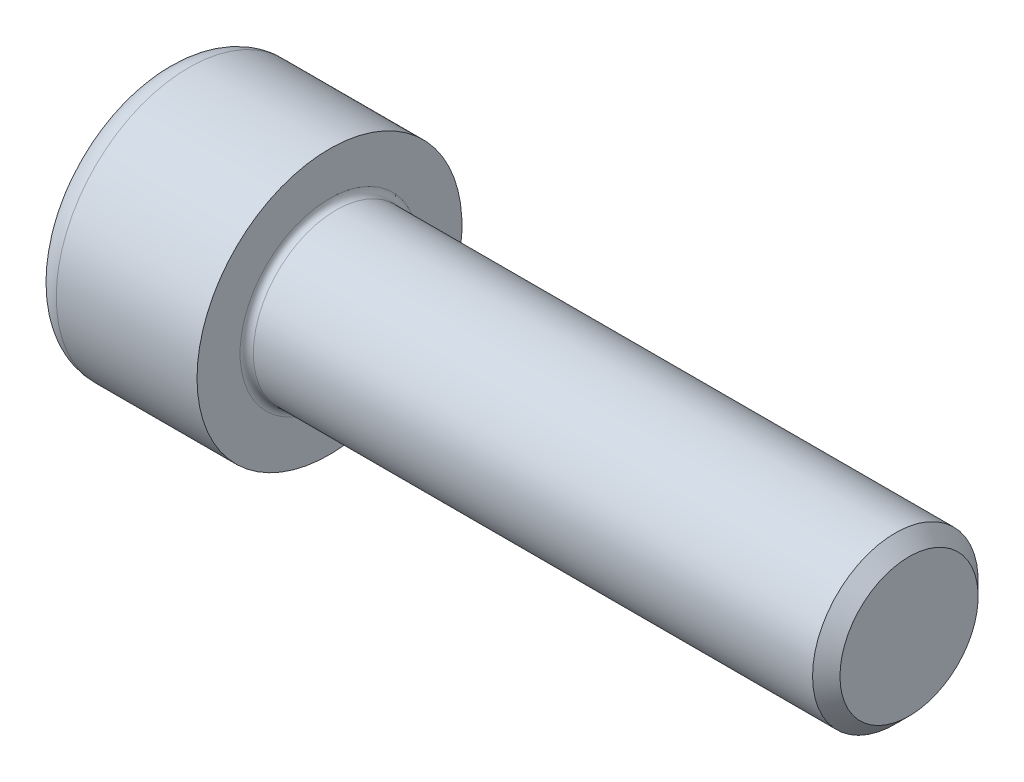
ISO-10303-21;
HEADER;
FILE_DESCRIPTION(('STEP AP214'),'2;1');
FILE_NAME('part.step','',(''),(''),'','','');
FILE_SCHEMA(('AUTOMOTIVE_DESIGN { 1 0 10303 214 1 1 1 1 }'));
ENDSEC;
DATA;
#1=APPLICATION_CONTEXT('core data for automotive mechanical design processes');
#2=APPLICATION_PROTOCOL_DEFINITION('international standard','automotive_design',2000,#1);
#3=PRODUCT_CONTEXT('',#1,'mechanical');
#4=PRODUCT('Part','Part','',(#3));
#5=PRODUCT_RELATED_PRODUCT_CATEGORY('part','',(#4));
#6=PRODUCT_DEFINITION_FORMATION('','',#4);
#7=PRODUCT_DEFINITION_CONTEXT('part definition',#1,'design');
#8=PRODUCT_DEFINITION('design','',#6,#7);
#9=PRODUCT_DEFINITION_SHAPE('','',#8);
#10=(LENGTH_UNIT() NAMED_UNIT(*) SI_UNIT(.MILLI.,.METRE.));
#11=(NAMED_UNIT(*) PLANE_ANGLE_UNIT() SI_UNIT($,.RADIAN.));
#12=(NAMED_UNIT(*) SI_UNIT($,.STERADIAN.) SOLID_ANGLE_UNIT());
#13=UNCERTAINTY_MEASURE_WITH_UNIT(LENGTH_MEASURE(1.E-05),#10,'distance_accuracy_value','');
#14=(GEOMETRIC_REPRESENTATION_CONTEXT(3) GLOBAL_UNCERTAINTY_ASSIGNED_CONTEXT((#13)) GLOBAL_UNIT_ASSIGNED_CONTEXT((#10,
#11,#12)) REPRESENTATION_CONTEXT('',''));
#15=CARTESIAN_POINT('',(0.,0.,0.));
#16=DIRECTION('',(0.,0.,1.));
#17=DIRECTION('',(1.,0.,0.));
#18=AXIS2_PLACEMENT_3D('',#15,#16,#17);
#19=CARTESIAN_POINT('',(0.,0.,0.));
#20=DIRECTION('',(-1.,0.,0.));
#21=DIRECTION('',(0.,0.,1.));
#22=AXIS2_PLACEMENT_3D('',#19,#20,#21);
#23=PLANE('',#22);
#24=DIRECTION('',(0.,-0.499999999999998,0.86602540378444));
#25=VECTOR('',#24,1.);
#26=CARTESIAN_POINT('',(0.,4.68519743447381,0.));
#27=LINE('',#26,#25);
#28=CARTESIAN_POINT('',(0.,4.68519743447381,0.));
#29=VERTEX_POINT('',#28);
#30=CARTESIAN_POINT('',(0.,2.34259871723691,4.05749999999999));
#31=VERTEX_POINT('',#30);
#32=EDGE_CURVE('E258',#29,#31,#27,.T.);
#33=ORIENTED_EDGE('',*,*,#32,.T.);
#34=DIRECTION('',(0.,1.,0.));
#35=VECTOR('',#34,1.);
#36=CARTESIAN_POINT('',(0.,-2.3425987172369,4.05749999999999));
#37=LINE('',#36,#35);
#38=CARTESIAN_POINT('',(0.,-2.3425987172369,4.05749999999999));
#39=VERTEX_POINT('',#38);
#40=EDGE_CURVE('E130',#39,#31,#37,.T.);
#41=ORIENTED_EDGE('',*,*,#40,.F.);
#42=DIRECTION('',(0.,-0.500000000000001,-0.866025403784438));
#43=VECTOR('',#42,1.);
#44=CARTESIAN_POINT('',(0.,-2.3425987172369,4.05749999999999));
#45=LINE('',#44,#43);
#46=CARTESIAN_POINT('',(0.,-4.68519743447381,0.));
#47=VERTEX_POINT('',#46);
#48=EDGE_CURVE('E261',#39,#47,#45,.T.);
#49=ORIENTED_EDGE('',*,*,#48,.T.);
#50=DIRECTION('',(0.,0.499999999999998,-0.86602540378444));
#51=VECTOR('',#50,1.);
#52=CARTESIAN_POINT('',(0.,-4.68519743447381,0.));
#53=LINE('',#52,#51);
#54=CARTESIAN_POINT('',(0.,-2.34259871723691,-4.0575));
#55=VERTEX_POINT('',#54);
#56=EDGE_CURVE('E264',#47,#55,#53,.T.);
#57=ORIENTED_EDGE('',*,*,#56,.T.);
#58=DIRECTION('',(0.,-1.,0.));
#59=VECTOR('',#58,1.);
#60=CARTESIAN_POINT('',(0.,2.3425987172369,-4.05750000000001));
#61=LINE('',#60,#59);
#62=CARTESIAN_POINT('',(0.,2.3425987172369,-4.05750000000001));
#63=VERTEX_POINT('',#62);
#64=EDGE_CURVE('E267',#63,#55,#61,.T.);
#65=ORIENTED_EDGE('',*,*,#64,.F.);
#66=DIRECTION('',(0.,-0.500000000000001,-0.866025403784438));
#67=VECTOR('',#66,1.);
#68=CARTESIAN_POINT('',(0.,4.68519743447381,0.));
#69=LINE('',#68,#67);
#70=EDGE_CURVE('E125',#29,#63,#69,.T.);
#71=ORIENTED_EDGE('',*,*,#70,.F.);
#72=EDGE_LOOP('',(#33,#41,#49,#57,#65,#71));
#73=FACE_BOUND('',#72,.T.);
#74=CARTESIAN_POINT('',(0.,0.,0.));
#75=DIRECTION('',(-1.,0.,0.));
#76=DIRECTION('',(0.,0.,1.));
#77=AXIS2_PLACEMENT_3D('',#74,#75,#76);
#78=CIRCLE('',#77,6.5);
#79=CARTESIAN_POINT('',(0.,0.,6.5));
#80=VERTEX_POINT('',#79);
#81=EDGE_CURVE('E42',#80,#80,#78,.T.);
#82=ORIENTED_EDGE('',*,*,#81,.T.);
#83=EDGE_LOOP('',(#82));
#84=FACE_BOUND('',#83,.T.);
#85=ADVANCED_FACE('F34',(#73,#84),#23,.T.);
#86=CARTESIAN_POINT('',(-31.75,0.,0.));
#87=DIRECTION('',(-1.,0.,0.));
#88=DIRECTION('',(0.,0.,1.));
#89=AXIS2_PLACEMENT_3D('',#86,#87,#88);
#90=CYLINDRICAL_SURFACE('',#89,8.);
#91=CARTESIAN_POINT('',(1.5,0.,0.));
#92=DIRECTION('',(-1.,0.,0.));
#93=DIRECTION('',(0.,0.,1.));
#94=AXIS2_PLACEMENT_3D('',#91,#92,#93);
#95=CIRCLE('',#94,8.);
#96=CARTESIAN_POINT('',(1.5,0.,8.));
#97=VERTEX_POINT('',#96);
#98=EDGE_CURVE('E11',#97,#97,#95,.F.);
#99=ORIENTED_EDGE('',*,*,#98,.T.);
#100=EDGE_LOOP('',(#99));
#101=FACE_BOUND('',#100,.T.);
#102=CARTESIAN_POINT('',(10.,0.,0.));
#103=DIRECTION('',(-1.,0.,0.));
#104=DIRECTION('',(0.,0.,1.));
#105=AXIS2_PLACEMENT_3D('',#102,#103,#104);
#106=CIRCLE('',#105,8.);
#107=CARTESIAN_POINT('',(10.,0.,8.));
#108=VERTEX_POINT('',#107);
#109=EDGE_CURVE('E148',#108,#108,#106,.T.);
#110=ORIENTED_EDGE('',*,*,#109,.T.);
#111=EDGE_LOOP('',(#110));
#112=FACE_BOUND('',#111,.T.);
#113=ADVANCED_FACE('F172',(#101,#112),#90,.T.);
#114=CARTESIAN_POINT('',(10.,8.,0.));
#115=DIRECTION('',(1.,0.,0.));
#116=DIRECTION('',(0.,0.,-1.));
#117=AXIS2_PLACEMENT_3D('',#114,#115,#116);
#118=PLANE('',#117);
#119=CARTESIAN_POINT('',(10.,0.,0.));
#120=DIRECTION('',(1.,0.,0.));
#121=DIRECTION('',(0.,0.,-1.));
#122=AXIS2_PLACEMENT_3D('',#119,#120,#121);
#123=CIRCLE('',#122,5.39999999999993);
#124=CARTESIAN_POINT('',(10.,0.,-5.39999999999993));
#125=VERTEX_POINT('',#124);
#126=EDGE_CURVE('E151',#125,#125,#123,.F.);
#127=ORIENTED_EDGE('',*,*,#126,.T.);
#128=EDGE_LOOP('',(#127));
#129=FACE_BOUND('',#128,.T.);
#130=ORIENTED_EDGE('',*,*,#109,.F.);
#131=EDGE_LOOP('',(#130));
#132=FACE_BOUND('',#131,.T.);
#133=ADVANCED_FACE('F178',(#129,#132),#118,.T.);
#134=CARTESIAN_POINT('',(-31.75,0.,0.));
#135=DIRECTION('',(-1.,0.,0.));
#136=DIRECTION('',(0.,0.,1.));
#137=AXIS2_PLACEMENT_3D('',#134,#135,#136);
#138=CYLINDRICAL_SURFACE('',#137,4.99999999999993);
#139=CARTESIAN_POINT('',(10.4,0.,0.));
#140=DIRECTION('',(1.,0.,0.));
#141=DIRECTION('',(0.,0.,-1.));
#142=AXIS2_PLACEMENT_3D('',#139,#140,#141);
#143=CIRCLE('',#142,4.99999999999993);
#144=CARTESIAN_POINT('',(10.4,0.,-4.99999999999993));
#145=VERTEX_POINT('',#144);
#146=EDGE_CURVE('E154',#145,#145,#143,.T.);
#147=ORIENTED_EDGE('',*,*,#146,.T.);
#148=EDGE_LOOP('',(#147));
#149=FACE_BOUND('',#148,.T.);
#150=CARTESIAN_POINT('',(44.1719999999999,0.,0.));
#151=DIRECTION('',(-1.,0.,0.));
#152=DIRECTION('',(0.,0.,1.));
#153=AXIS2_PLACEMENT_3D('',#150,#151,#152);
#154=CIRCLE('',#153,4.99999999999986);
#155=CARTESIAN_POINT('',(44.1719999999999,0.,4.99999999999986));
#156=VERTEX_POINT('',#155);
#157=EDGE_CURVE('E145',#156,#156,#154,.T.);
#158=ORIENTED_EDGE('',*,*,#157,.T.);
#159=EDGE_LOOP('',(#158));
#160=FACE_BOUND('',#159,.T.);
#161=ADVANCED_FACE('F184',(#149,#160),#138,.T.);
#162=CARTESIAN_POINT('',(45.,0.,0.));
#163=DIRECTION('',(-1.,0.,0.));
#164=DIRECTION('',(0.,0.,1.));
#165=AXIS2_PLACEMENT_3D('',#162,#163,#164);
#166=CONICAL_SURFACE('',#165,4.172,0.785398163397283);
#167=ORIENTED_EDGE('',*,*,#157,.F.);
#168=EDGE_LOOP('',(#167));
#169=FACE_BOUND('',#168,.T.);
#170=CARTESIAN_POINT('',(45.,0.,0.));
#171=DIRECTION('',(-1.,0.,0.));
#172=DIRECTION('',(0.,0.,1.));
#173=AXIS2_PLACEMENT_3D('',#170,#171,#172);
#174=CIRCLE('',#173,4.172);
#175=CARTESIAN_POINT('',(45.,0.,4.172));
#176=VERTEX_POINT('',#175);
#177=EDGE_CURVE('E141',#176,#176,#174,.T.);
#178=ORIENTED_EDGE('',*,*,#177,.T.);
#179=EDGE_LOOP('',(#178));
#180=FACE_BOUND('',#179,.T.);
#181=ADVANCED_FACE('F188',(#169,#180),#166,.T.);
#182=CARTESIAN_POINT('',(45.,4.172,0.));
#183=DIRECTION('',(1.,0.,0.));
#184=DIRECTION('',(0.,0.,-1.));
#185=AXIS2_PLACEMENT_3D('',#182,#183,#184);
#186=PLANE('',#185);
#187=ORIENTED_EDGE('',*,*,#177,.F.);
#188=EDGE_LOOP('',(#187));
#189=FACE_BOUND('',#188,.T.);
#190=ADVANCED_FACE('F168',(#189),#186,.T.);
#191=CARTESIAN_POINT('',(10.4,0.,0.));
#192=DIRECTION('',(1.,0.,0.));
#193=DIRECTION('',(0.,0.,-1.));
#194=AXIS2_PLACEMENT_3D('',#191,#192,#193);
#195=TOROIDAL_SURFACE('',#194,5.39999999999993,0.4);
#196=ORIENTED_EDGE('',*,*,#146,.F.);
#197=EDGE_LOOP('',(#196));
#198=FACE_BOUND('',#197,.T.);
#199=ORIENTED_EDGE('',*,*,#126,.F.);
#200=EDGE_LOOP('',(#199));
#201=FACE_BOUND('',#200,.T.);
#202=ADVANCED_FACE('F161',(#198,#201),#195,.F.);
#203=CARTESIAN_POINT('',(1.5,0.,0.));
#204=DIRECTION('',(-1.,0.,0.));
#205=DIRECTION('',(0.,0.,1.));
#206=AXIS2_PLACEMENT_3D('',#203,#204,#205);
#207=TOROIDAL_SURFACE('',#206,6.5,1.5);
#208=ORIENTED_EDGE('',*,*,#98,.F.);
#209=EDGE_LOOP('',(#208));
#210=FACE_BOUND('',#209,.T.);
#211=ORIENTED_EDGE('',*,*,#81,.F.);
#212=EDGE_LOOP('',(#211));
#213=FACE_BOUND('',#212,.T.);
#214=ADVANCED_FACE('F36',(#210,#213),#207,.T.);
#215=CARTESIAN_POINT('',(5.,4.68519743447381,0.));
#216=DIRECTION('',(0.,-0.86602540378444,-0.499999999999998));
#217=DIRECTION('',(0.,0.499999999999998,-0.86602540378444));
#218=AXIS2_PLACEMENT_3D('',#215,#216,#217);
#219=PLANE('',#218);
#220=ORIENTED_EDGE('',*,*,#32,.F.);
#221=DIRECTION('',(-1.,0.,0.));
#222=VECTOR('',#221,1.);
#223=CARTESIAN_POINT('',(5.,4.68519743447381,0.));
#224=LINE('',#223,#222);
#225=CARTESIAN_POINT('',(5.,4.68519743447381,0.));
#226=VERTEX_POINT('',#225);
#227=EDGE_CURVE('E248',#226,#29,#224,.T.);
#228=ORIENTED_EDGE('',*,*,#227,.F.);
#229=DIRECTION('',(0.,-0.499999999999998,0.86602540378444));
#230=VECTOR('',#229,1.);
#231=CARTESIAN_POINT('',(5.,4.68519743447381,0.));
#232=LINE('',#231,#230);
#233=CARTESIAN_POINT('',(5.,3.51389807585536,2.02874999999999));
#234=VERTEX_POINT('',#233);
#235=EDGE_CURVE('E117',#226,#234,#232,.T.);
#236=ORIENTED_EDGE('',*,*,#235,.T.);
#237=CARTESIAN_POINT('',(5.,2.34259871723691,4.05749999999999));
#238=VERTEX_POINT('',#237);
#239=EDGE_CURVE('E108',#234,#238,#232,.T.);
#240=ORIENTED_EDGE('',*,*,#239,.T.);
#241=DIRECTION('',(-1.,0.,0.));
#242=VECTOR('',#241,1.);
#243=CARTESIAN_POINT('',(5.,2.34259871723691,4.05749999999999));
#244=LINE('',#243,#242);
#245=EDGE_CURVE('E122',#238,#31,#244,.T.);
#246=ORIENTED_EDGE('',*,*,#245,.T.);
#247=EDGE_LOOP('',(#220,#228,#236,#240,#246));
#248=FACE_BOUND('',#247,.T.);
#249=ADVANCED_FACE('F121',(#248),#219,.T.);
#250=CARTESIAN_POINT('',(5.,-2.3425987172369,4.05749999999999));
#251=DIRECTION('',(0.,0.,1.));
#252=DIRECTION('',(0.,-1.,0.));
#253=AXIS2_PLACEMENT_3D('',#250,#251,#252);
#254=PLANE('',#253);
#255=ORIENTED_EDGE('',*,*,#40,.T.);
#256=ORIENTED_EDGE('',*,*,#245,.F.);
#257=DIRECTION('',(0.,1.,0.));
#258=VECTOR('',#257,1.);
#259=CARTESIAN_POINT('',(5.,-2.3425987172369,4.05749999999999));
#260=LINE('',#259,#258);
#261=CARTESIAN_POINT('',(5.,0.,4.05749999999999));
#262=VERTEX_POINT('',#261);
#263=EDGE_CURVE('E105',#262,#238,#260,.T.);
#264=ORIENTED_EDGE('',*,*,#263,.F.);
#265=CARTESIAN_POINT('',(5.,-2.3425987172369,4.05749999999999));
#266=VERTEX_POINT('',#265);
#267=EDGE_CURVE('E116',#266,#262,#260,.T.);
#268=ORIENTED_EDGE('',*,*,#267,.F.);
#269=DIRECTION('',(-1.,0.,0.));
#270=VECTOR('',#269,1.);
#271=CARTESIAN_POINT('',(5.,-2.3425987172369,4.05749999999999));
#272=LINE('',#271,#270);
#273=EDGE_CURVE('E132',#266,#39,#272,.T.);
#274=ORIENTED_EDGE('',*,*,#273,.T.);
#275=EDGE_LOOP('',(#255,#256,#264,#268,#274));
#276=FACE_BOUND('',#275,.T.);
#277=ADVANCED_FACE('F127',(#276),#254,.F.);
#278=CARTESIAN_POINT('',(5.,-2.3425987172369,4.05749999999999));
#279=DIRECTION('',(0.,0.866025403784438,-0.500000000000001));
#280=DIRECTION('',(0.,0.500000000000001,0.866025403784438));
#281=AXIS2_PLACEMENT_3D('',#278,#279,#280);
#282=PLANE('',#281);
#283=ORIENTED_EDGE('',*,*,#48,.F.);
#284=ORIENTED_EDGE('',*,*,#273,.F.);
#285=DIRECTION('',(0.,-0.500000000000001,-0.866025403784438));
#286=VECTOR('',#285,1.);
#287=CARTESIAN_POINT('',(5.,-2.3425987172369,4.05749999999999));
#288=LINE('',#287,#286);
#289=CARTESIAN_POINT('',(5.,-3.51389807585535,2.02875));
#290=VERTEX_POINT('',#289);
#291=EDGE_CURVE('E287',#266,#290,#288,.T.);
#292=ORIENTED_EDGE('',*,*,#291,.T.);
#293=CARTESIAN_POINT('',(5.,-4.68519743447381,0.));
#294=VERTEX_POINT('',#293);
#295=EDGE_CURVE('E276',#290,#294,#288,.T.);
#296=ORIENTED_EDGE('',*,*,#295,.T.);
#297=DIRECTION('',(-1.,0.,0.));
#298=VECTOR('',#297,1.);
#299=CARTESIAN_POINT('',(5.,-4.68519743447381,0.));
#300=LINE('',#299,#298);
#301=EDGE_CURVE('E137',#294,#47,#300,.T.);
#302=ORIENTED_EDGE('',*,*,#301,.T.);
#303=EDGE_LOOP('',(#283,#284,#292,#296,#302));
#304=FACE_BOUND('',#303,.T.);
#305=ADVANCED_FACE('F202',(#304),#282,.T.);
#306=CARTESIAN_POINT('',(5.,-4.68519743447381,0.));
#307=DIRECTION('',(0.,0.86602540378444,0.499999999999998));
#308=DIRECTION('',(0.,-0.499999999999998,0.86602540378444));
#309=AXIS2_PLACEMENT_3D('',#306,#307,#308);
#310=PLANE('',#309);
#311=ORIENTED_EDGE('',*,*,#56,.F.);
#312=ORIENTED_EDGE('',*,*,#301,.F.);
#313=DIRECTION('',(0.,0.499999999999998,-0.86602540378444));
#314=VECTOR('',#313,1.);
#315=CARTESIAN_POINT('',(5.,-4.68519743447381,0.));
#316=LINE('',#315,#314);
#317=CARTESIAN_POINT('',(5.,-3.51389807585537,-2.02874999999999));
#318=VERTEX_POINT('',#317);
#319=EDGE_CURVE('E254',#294,#318,#316,.T.);
#320=ORIENTED_EDGE('',*,*,#319,.T.);
#321=CARTESIAN_POINT('',(5.,-2.34259871723691,-4.0575));
#322=VERTEX_POINT('',#321);
#323=EDGE_CURVE('E286',#318,#322,#316,.T.);
#324=ORIENTED_EDGE('',*,*,#323,.T.);
#325=DIRECTION('',(-1.,0.,0.));
#326=VECTOR('',#325,1.);
#327=CARTESIAN_POINT('',(5.,-2.34259871723691,-4.0575));
#328=LINE('',#327,#326);
#329=EDGE_CURVE('E247',#322,#55,#328,.T.);
#330=ORIENTED_EDGE('',*,*,#329,.T.);
#331=EDGE_LOOP('',(#311,#312,#320,#324,#330));
#332=FACE_BOUND('',#331,.T.);
#333=ADVANCED_FACE('F205',(#332),#310,.T.);
#334=CARTESIAN_POINT('',(5.,2.3425987172369,-4.05750000000001));
#335=DIRECTION('',(0.,0.,-1.));
#336=DIRECTION('',(0.,1.,0.));
#337=AXIS2_PLACEMENT_3D('',#334,#335,#336);
#338=PLANE('',#337);
#339=ORIENTED_EDGE('',*,*,#64,.T.);
#340=ORIENTED_EDGE('',*,*,#329,.F.);
#341=DIRECTION('',(0.,-1.,0.));
#342=VECTOR('',#341,1.);
#343=CARTESIAN_POINT('',(5.,2.3425987172369,-4.05750000000001));
#344=LINE('',#343,#342);
#345=CARTESIAN_POINT('',(5.,0.,-4.0575));
#346=VERTEX_POINT('',#345);
#347=EDGE_CURVE('E251',#346,#322,#344,.T.);
#348=ORIENTED_EDGE('',*,*,#347,.F.);
#349=CARTESIAN_POINT('',(5.,2.3425987172369,-4.05750000000001));
#350=VERTEX_POINT('',#349);
#351=EDGE_CURVE('E49',#350,#346,#344,.T.);
#352=ORIENTED_EDGE('',*,*,#351,.F.);
#353=DIRECTION('',(-1.,0.,0.));
#354=VECTOR('',#353,1.);
#355=CARTESIAN_POINT('',(5.,2.3425987172369,-4.05750000000001));
#356=LINE('',#355,#354);
#357=EDGE_CURVE('E244',#350,#63,#356,.T.);
#358=ORIENTED_EDGE('',*,*,#357,.T.);
#359=EDGE_LOOP('',(#339,#340,#348,#352,#358));
#360=FACE_BOUND('',#359,.T.);
#361=ADVANCED_FACE('F209',(#360),#338,.F.);
#362=CARTESIAN_POINT('',(5.,4.68519743447381,0.));
#363=DIRECTION('',(0.,0.866025403784438,-0.500000000000001));
#364=DIRECTION('',(0.,0.500000000000001,0.866025403784438));
#365=AXIS2_PLACEMENT_3D('',#362,#363,#364);
#366=PLANE('',#365);
#367=ORIENTED_EDGE('',*,*,#70,.T.);
#368=ORIENTED_EDGE('',*,*,#357,.F.);
#369=DIRECTION('',(0.,-0.500000000000001,-0.866025403784438));
#370=VECTOR('',#369,1.);
#371=CARTESIAN_POINT('',(5.,4.68519743447381,0.));
#372=LINE('',#371,#370);
#373=CARTESIAN_POINT('',(5.,3.51389807585536,-2.02875));
#374=VERTEX_POINT('',#373);
#375=EDGE_CURVE('E234',#374,#350,#372,.T.);
#376=ORIENTED_EDGE('',*,*,#375,.F.);
#377=EDGE_CURVE('E240',#226,#374,#372,.T.);
#378=ORIENTED_EDGE('',*,*,#377,.F.);
#379=ORIENTED_EDGE('',*,*,#227,.T.);
#380=EDGE_LOOP('',(#367,#368,#376,#378,#379));
#381=FACE_BOUND('',#380,.T.);
#382=ADVANCED_FACE('F213',(#381),#366,.F.);
#383=CARTESIAN_POINT('',(5.,7.0277961517107,-4.05750000000001));
#384=DIRECTION('',(1.,0.,0.));
#385=DIRECTION('',(0.,0.,-1.));
#386=AXIS2_PLACEMENT_3D('',#383,#384,#385);
#387=PLANE('',#386);
#388=ORIENTED_EDGE('',*,*,#347,.T.);
#389=ORIENTED_EDGE('',*,*,#323,.F.);
#390=CARTESIAN_POINT('',(5.,0.,0.));
#391=DIRECTION('',(-1.,0.,0.));
#392=DIRECTION('',(0.,0.,1.));
#393=AXIS2_PLACEMENT_3D('',#390,#391,#392);
#394=CIRCLE('',#393,4.0575);
#395=EDGE_CURVE('E282',#346,#318,#394,.T.);
#396=ORIENTED_EDGE('',*,*,#395,.F.);
#397=EDGE_LOOP('',(#388,#389,#396));
#398=FACE_BOUND('',#397,.T.);
#399=ADVANCED_FACE('F217',(#398),#387,.F.);
#400=ORIENTED_EDGE('',*,*,#319,.F.);
#401=ORIENTED_EDGE('',*,*,#295,.F.);
#402=EDGE_CURVE('E135',#318,#290,#394,.T.);
#403=ORIENTED_EDGE('',*,*,#402,.F.);
#404=EDGE_LOOP('',(#400,#401,#403));
#405=FACE_BOUND('',#404,.T.);
#406=ADVANCED_FACE('F220',(#405),#387,.F.);
#407=ORIENTED_EDGE('',*,*,#291,.F.);
#408=ORIENTED_EDGE('',*,*,#267,.T.);
#409=EDGE_CURVE('E131',#290,#262,#394,.T.);
#410=ORIENTED_EDGE('',*,*,#409,.F.);
#411=EDGE_LOOP('',(#407,#408,#410));
#412=FACE_BOUND('',#411,.T.);
#413=ADVANCED_FACE('F225',(#412),#387,.F.);
#414=ORIENTED_EDGE('',*,*,#263,.T.);
#415=ORIENTED_EDGE('',*,*,#239,.F.);
#416=EDGE_CURVE('E111',#262,#234,#394,.T.);
#417=ORIENTED_EDGE('',*,*,#416,.F.);
#418=EDGE_LOOP('',(#414,#415,#417));
#419=FACE_BOUND('',#418,.T.);
#420=ADVANCED_FACE('F107',(#419),#387,.F.);
#421=ORIENTED_EDGE('',*,*,#235,.F.);
#422=ORIENTED_EDGE('',*,*,#377,.T.);
#423=EDGE_CURVE('E142',#234,#374,#394,.T.);
#424=ORIENTED_EDGE('',*,*,#423,.F.);
#425=EDGE_LOOP('',(#421,#422,#424));
#426=FACE_BOUND('',#425,.T.);
#427=ADVANCED_FACE('F228',(#426),#387,.F.);
#428=ORIENTED_EDGE('',*,*,#375,.T.);
#429=ORIENTED_EDGE('',*,*,#351,.T.);
#430=EDGE_CURVE('E237',#374,#346,#394,.T.);
#431=ORIENTED_EDGE('',*,*,#430,.F.);
#432=EDGE_LOOP('',(#428,#429,#431));
#433=FACE_BOUND('',#432,.T.);
#434=ADVANCED_FACE('F198',(#433),#387,.F.);
#435=CARTESIAN_POINT('',(5.,0.,0.));
#436=DIRECTION('',(-1.,0.,0.));
#437=DIRECTION('',(0.,0.,1.));
#438=AXIS2_PLACEMENT_3D('',#435,#436,#437);
#439=CONICAL_SURFACE('',#438,4.0575,1.04719755119659);
#440=CARTESIAN_POINT('',(7.34259871723693,0.,0.));
#441=VERTEX_POINT('',#440);
#442=VERTEX_LOOP('',#441);
#443=FACE_BOUND('',#442,.T.);
#444=ORIENTED_EDGE('',*,*,#416,.T.);
#445=ORIENTED_EDGE('',*,*,#423,.T.);
#446=ORIENTED_EDGE('',*,*,#430,.T.);
#447=ORIENTED_EDGE('',*,*,#395,.T.);
#448=ORIENTED_EDGE('',*,*,#402,.T.);
#449=ORIENTED_EDGE('',*,*,#409,.T.);
#450=EDGE_LOOP('',(#444,#445,#446,#447,#448,#449));
#451=FACE_BOUND('',#450,.T.);
#452=ADVANCED_FACE('F196',(#443,#451),#439,.F.);
#453=CLOSED_SHELL('',(#85,#113,#133,#161,#181,#190,#202,#214,#249,#277,#305,#333,#361,#382,#399,
#406,#413,#420,#427,#434,#452));
#454=MANIFOLD_SOLID_BREP('B2',#453);
#455=ADVANCED_BREP_SHAPE_REPRESENTATION('',(#18,#454),#14);
#456=SHAPE_DEFINITION_REPRESENTATION(#9,#455);
ENDSEC;
END-ISO-10303-21;
